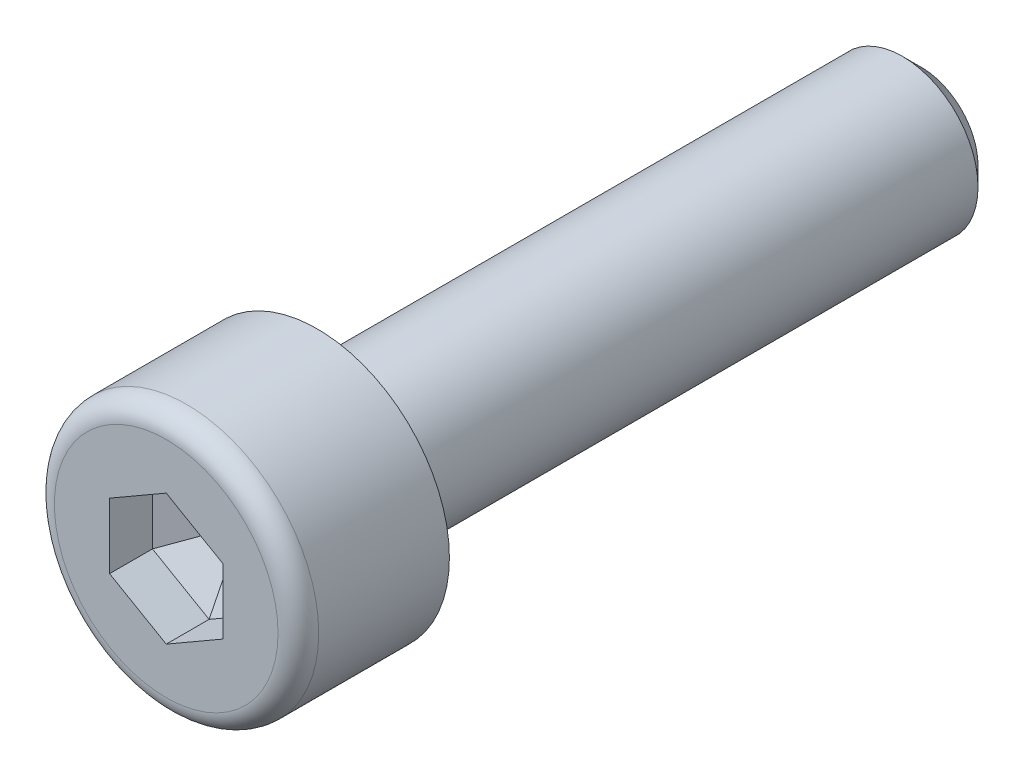
ISO-10303-21;
HEADER;
FILE_DESCRIPTION(('STEP AP214'),'2;1');
FILE_NAME('part.step','',(''),(''),'','','');
FILE_SCHEMA(('AUTOMOTIVE_DESIGN { 1 0 10303 214 1 1 1 1 }'));
ENDSEC;
DATA;
#1=APPLICATION_CONTEXT('core data for automotive mechanical design processes');
#2=APPLICATION_PROTOCOL_DEFINITION('international standard','automotive_design',2000,#1);
#3=PRODUCT_CONTEXT('',#1,'mechanical');
#4=PRODUCT('Part','Part','',(#3));
#5=PRODUCT_RELATED_PRODUCT_CATEGORY('part','',(#4));
#6=PRODUCT_DEFINITION_FORMATION('','',#4);
#7=PRODUCT_DEFINITION_CONTEXT('part definition',#1,'design');
#8=PRODUCT_DEFINITION('design','',#6,#7);
#9=PRODUCT_DEFINITION_SHAPE('','',#8);
#10=(LENGTH_UNIT() NAMED_UNIT(*) SI_UNIT(.MILLI.,.METRE.));
#11=(NAMED_UNIT(*) PLANE_ANGLE_UNIT() SI_UNIT($,.RADIAN.));
#12=(NAMED_UNIT(*) SI_UNIT($,.STERADIAN.) SOLID_ANGLE_UNIT());
#13=UNCERTAINTY_MEASURE_WITH_UNIT(LENGTH_MEASURE(1.E-05),#10,'distance_accuracy_value','');
#14=(GEOMETRIC_REPRESENTATION_CONTEXT(3) GLOBAL_UNCERTAINTY_ASSIGNED_CONTEXT((#13)) GLOBAL_UNIT_ASSIGNED_CONTEXT((#10,
#11,#12)) REPRESENTATION_CONTEXT('',''));
#15=CARTESIAN_POINT('',(0.,0.,0.));
#16=DIRECTION('',(0.,0.,1.));
#17=DIRECTION('',(1.,0.,0.));
#18=AXIS2_PLACEMENT_3D('',#15,#16,#17);
#19=CARTESIAN_POINT('',(0.,0.,0.));
#20=DIRECTION('',(0.,0.,1.));
#21=DIRECTION('',(1.,0.,0.));
#22=AXIS2_PLACEMENT_3D('',#19,#20,#21);
#23=PLANE('',#22);
#24=CARTESIAN_POINT('',(0.,0.,0.));
#25=DIRECTION('',(0.,0.,1.));
#26=DIRECTION('',(1.,0.,0.));
#27=AXIS2_PLACEMENT_3D('',#24,#25,#26);
#28=CIRCLE('',#27,2.1);
#29=CARTESIAN_POINT('',(2.1,0.,0.));
#30=VERTEX_POINT('',#29);
#31=EDGE_CURVE('E11',#30,#30,#28,.T.);
#32=ORIENTED_EDGE('',*,*,#31,.T.);
#33=EDGE_LOOP('',(#32));
#34=FACE_BOUND('',#33,.T.);
#35=CARTESIAN_POINT('',(0.,0.,0.));
#36=DIRECTION('',(0.,0.,1.));
#37=DIRECTION('',(1.,0.,0.));
#38=AXIS2_PLACEMENT_3D('',#35,#36,#37);
#39=CIRCLE('',#38,3.5);
#40=CARTESIAN_POINT('',(3.5,0.,0.));
#41=VERTEX_POINT('',#40);
#42=EDGE_CURVE('E154',#41,#41,#39,.T.);
#43=ORIENTED_EDGE('',*,*,#42,.F.);
#44=EDGE_LOOP('',(#43));
#45=FACE_BOUND('',#44,.T.);
#46=ADVANCED_FACE('F44',(#34,#45),#23,.F.);
#47=CARTESIAN_POINT('',(0.,0.,4.));
#48=DIRECTION('',(0.,0.,-1.));
#49=DIRECTION('',(-1.,0.,0.));
#50=AXIS2_PLACEMENT_3D('',#47,#48,#49);
#51=CYLINDRICAL_SURFACE('',#50,3.5);
#52=CARTESIAN_POINT('',(0.,0.,3.46153846153846));
#53=DIRECTION('',(0.,0.,1.));
#54=DIRECTION('',(1.,0.,0.));
#55=AXIS2_PLACEMENT_3D('',#52,#53,#54);
#56=CIRCLE('',#55,3.5);
#57=CARTESIAN_POINT('',(3.5,0.,3.46153846153846));
#58=VERTEX_POINT('',#57);
#59=EDGE_CURVE('E172',#58,#58,#56,.F.);
#60=ORIENTED_EDGE('',*,*,#59,.T.);
#61=EDGE_LOOP('',(#60));
#62=FACE_BOUND('',#61,.T.);
#63=ORIENTED_EDGE('',*,*,#42,.T.);
#64=EDGE_LOOP('',(#63));
#65=FACE_BOUND('',#64,.T.);
#66=ADVANCED_FACE('F231',(#62,#65),#51,.T.);
#67=CARTESIAN_POINT('',(0.,0.,4.));
#68=DIRECTION('',(0.,0.,1.));
#69=DIRECTION('',(1.,0.,0.));
#70=AXIS2_PLACEMENT_3D('',#67,#68,#69);
#71=PLANE('',#70);
#72=CARTESIAN_POINT('',(0.,0.,4.));
#73=DIRECTION('',(0.,0.,1.));
#74=DIRECTION('',(1.,0.,0.));
#75=AXIS2_PLACEMENT_3D('',#72,#73,#74);
#76=CIRCLE('',#75,2.96153846153846);
#77=CARTESIAN_POINT('',(2.96153846153846,0.,4.));
#78=VERTEX_POINT('',#77);
#79=EDGE_CURVE('E169',#78,#78,#76,.T.);
#80=ORIENTED_EDGE('',*,*,#79,.T.);
#81=EDGE_LOOP('',(#80));
#82=FACE_BOUND('',#81,.T.);
#83=DIRECTION('',(0.,1.,0.));
#84=VECTOR('',#83,1.);
#85=CARTESIAN_POINT('',(1.5,-0.866025403784439,4.));
#86=LINE('',#85,#84);
#87=CARTESIAN_POINT('',(1.5,-0.866025403784439,4.));
#88=VERTEX_POINT('',#87);
#89=CARTESIAN_POINT('',(1.5,0.866025403784439,4.));
#90=VERTEX_POINT('',#89);
#91=EDGE_CURVE('E136',#88,#90,#86,.T.);
#92=ORIENTED_EDGE('',*,*,#91,.F.);
#93=DIRECTION('',(0.866025403784439,0.5,0.));
#94=VECTOR('',#93,1.);
#95=CARTESIAN_POINT('',(0.,-1.73205080756888,4.));
#96=LINE('',#95,#94);
#97=CARTESIAN_POINT('',(0.,-1.73205080756888,4.));
#98=VERTEX_POINT('',#97);
#99=EDGE_CURVE('E149',#98,#88,#96,.T.);
#100=ORIENTED_EDGE('',*,*,#99,.F.);
#101=DIRECTION('',(0.866025403784439,-0.5,0.));
#102=VECTOR('',#101,1.);
#103=CARTESIAN_POINT('',(-1.5,-0.866025403784438,4.));
#104=LINE('',#103,#102);
#105=CARTESIAN_POINT('',(-1.5,-0.866025403784438,4.));
#106=VERTEX_POINT('',#105);
#107=EDGE_CURVE('E143',#106,#98,#104,.T.);
#108=ORIENTED_EDGE('',*,*,#107,.F.);
#109=DIRECTION('',(0.,-1.,0.));
#110=VECTOR('',#109,1.);
#111=CARTESIAN_POINT('',(-1.5,0.866025403784439,4.));
#112=LINE('',#111,#110);
#113=CARTESIAN_POINT('',(-1.5,0.866025403784439,4.));
#114=VERTEX_POINT('',#113);
#115=EDGE_CURVE('E141',#114,#106,#112,.T.);
#116=ORIENTED_EDGE('',*,*,#115,.F.);
#117=DIRECTION('',(-0.866025403784439,-0.5,0.));
#118=VECTOR('',#117,1.);
#119=CARTESIAN_POINT('',(0.,1.73205080756888,4.));
#120=LINE('',#119,#118);
#121=CARTESIAN_POINT('',(0.,1.73205080756888,4.));
#122=VERTEX_POINT('',#121);
#123=EDGE_CURVE('E121',#122,#114,#120,.T.);
#124=ORIENTED_EDGE('',*,*,#123,.F.);
#125=DIRECTION('',(-0.866025403784439,0.5,0.));
#126=VECTOR('',#125,1.);
#127=CARTESIAN_POINT('',(1.5,0.866025403784439,4.));
#128=LINE('',#127,#126);
#129=EDGE_CURVE('E131',#90,#122,#128,.T.);
#130=ORIENTED_EDGE('',*,*,#129,.F.);
#131=EDGE_LOOP('',(#92,#100,#108,#116,#124,#130));
#132=FACE_BOUND('',#131,.T.);
#133=ADVANCED_FACE('F138',(#82,#132),#71,.T.);
#134=CARTESIAN_POINT('',(1.5,-0.866025403784439,2.));
#135=DIRECTION('',(1.,0.,0.));
#136=DIRECTION('',(0.,1.,0.));
#137=AXIS2_PLACEMENT_3D('',#134,#135,#136);
#138=PLANE('',#137);
#139=DIRECTION('',(0.,0.,1.));
#140=VECTOR('',#139,1.);
#141=CARTESIAN_POINT('',(1.5,0.866025403784439,2.));
#142=LINE('',#141,#140);
#143=CARTESIAN_POINT('',(1.5,0.866025403784439,2.86455331412104));
#144=VERTEX_POINT('',#143);
#145=EDGE_CURVE('E128',#144,#90,#142,.T.);
#146=ORIENTED_EDGE('',*,*,#145,.F.);
#147=DIRECTION('',(0.,-1.,0.));
#148=VECTOR('',#147,1.);
#149=CARTESIAN_POINT('',(1.5,-0.866025403784439,2.86455331412104));
#150=LINE('',#149,#148);
#151=CARTESIAN_POINT('',(1.5,-0.866025403784439,2.86455331412104));
#152=VERTEX_POINT('',#151);
#153=EDGE_CURVE('E67',#144,#152,#150,.T.);
#154=ORIENTED_EDGE('',*,*,#153,.T.);
#155=DIRECTION('',(0.,0.,1.));
#156=VECTOR('',#155,1.);
#157=CARTESIAN_POINT('',(1.5,-0.866025403784439,2.));
#158=LINE('',#157,#156);
#159=EDGE_CURVE('E152',#152,#88,#158,.T.);
#160=ORIENTED_EDGE('',*,*,#159,.T.);
#161=ORIENTED_EDGE('',*,*,#91,.T.);
#162=EDGE_LOOP('',(#146,#154,#160,#161));
#163=FACE_BOUND('',#162,.T.);
#164=ADVANCED_FACE('F291',(#163),#138,.F.);
#165=CARTESIAN_POINT('',(0.,-1.73205080756888,2.));
#166=DIRECTION('',(0.5,-0.866025403784439,0.));
#167=DIRECTION('',(0.866025403784439,0.5,0.));
#168=AXIS2_PLACEMENT_3D('',#165,#166,#167);
#169=PLANE('',#168);
#170=ORIENTED_EDGE('',*,*,#159,.F.);
#171=DIRECTION('',(-0.866025403784439,-0.5,0.));
#172=VECTOR('',#171,1.);
#173=CARTESIAN_POINT('',(0.,-1.73205080756888,2.86455331412104));
#174=LINE('',#173,#172);
#175=CARTESIAN_POINT('',(0.,-1.73205080756888,2.86455331412104));
#176=VERTEX_POINT('',#175);
#177=EDGE_CURVE('E59',#152,#176,#174,.T.);
#178=ORIENTED_EDGE('',*,*,#177,.T.);
#179=DIRECTION('',(0.,0.,1.));
#180=VECTOR('',#179,1.);
#181=CARTESIAN_POINT('',(0.,-1.73205080756888,2.));
#182=LINE('',#181,#180);
#183=EDGE_CURVE('E155',#176,#98,#182,.T.);
#184=ORIENTED_EDGE('',*,*,#183,.T.);
#185=ORIENTED_EDGE('',*,*,#99,.T.);
#186=EDGE_LOOP('',(#170,#178,#184,#185));
#187=FACE_BOUND('',#186,.T.);
#188=ADVANCED_FACE('F293',(#187),#169,.F.);
#189=CARTESIAN_POINT('',(-1.5,-0.866025403784438,2.));
#190=DIRECTION('',(-0.5,-0.866025403784439,0.));
#191=DIRECTION('',(0.866025403784439,-0.5,0.));
#192=AXIS2_PLACEMENT_3D('',#189,#190,#191);
#193=PLANE('',#192);
#194=ORIENTED_EDGE('',*,*,#183,.F.);
#195=DIRECTION('',(-0.866025403784439,0.5,0.));
#196=VECTOR('',#195,1.);
#197=CARTESIAN_POINT('',(-1.5,-0.866025403784438,2.86455331412104));
#198=LINE('',#197,#196);
#199=CARTESIAN_POINT('',(-1.5,-0.866025403784438,2.86455331412104));
#200=VERTEX_POINT('',#199);
#201=EDGE_CURVE('E195',#176,#200,#198,.T.);
#202=ORIENTED_EDGE('',*,*,#201,.T.);
#203=DIRECTION('',(0.,0.,1.));
#204=VECTOR('',#203,1.);
#205=CARTESIAN_POINT('',(-1.5,-0.866025403784438,2.));
#206=LINE('',#205,#204);
#207=EDGE_CURVE('E157',#200,#106,#206,.T.);
#208=ORIENTED_EDGE('',*,*,#207,.T.);
#209=ORIENTED_EDGE('',*,*,#107,.T.);
#210=EDGE_LOOP('',(#194,#202,#208,#209));
#211=FACE_BOUND('',#210,.T.);
#212=ADVANCED_FACE('F282',(#211),#193,.F.);
#213=CARTESIAN_POINT('',(-1.5,0.866025403784439,2.));
#214=DIRECTION('',(-1.,0.,0.));
#215=DIRECTION('',(0.,0.,1.));
#216=AXIS2_PLACEMENT_3D('',#213,#214,#215);
#217=PLANE('',#216);
#218=ORIENTED_EDGE('',*,*,#207,.F.);
#219=DIRECTION('',(0.,1.,0.));
#220=VECTOR('',#219,1.);
#221=CARTESIAN_POINT('',(-1.5,0.866025403784439,2.86455331412104));
#222=LINE('',#221,#220);
#223=CARTESIAN_POINT('',(-1.5,0.866025403784439,2.86455331412104));
#224=VERTEX_POINT('',#223);
#225=EDGE_CURVE('E188',#200,#224,#222,.T.);
#226=ORIENTED_EDGE('',*,*,#225,.T.);
#227=DIRECTION('',(0.,0.,1.));
#228=VECTOR('',#227,1.);
#229=CARTESIAN_POINT('',(-1.5,0.866025403784439,2.));
#230=LINE('',#229,#228);
#231=EDGE_CURVE('E127',#224,#114,#230,.T.);
#232=ORIENTED_EDGE('',*,*,#231,.T.);
#233=ORIENTED_EDGE('',*,*,#115,.T.);
#234=EDGE_LOOP('',(#218,#226,#232,#233));
#235=FACE_BOUND('',#234,.T.);
#236=ADVANCED_FACE('F285',(#235),#217,.F.);
#237=CARTESIAN_POINT('',(0.,1.73205080756888,2.));
#238=DIRECTION('',(-0.5,0.866025403784439,0.));
#239=DIRECTION('',(-0.866025403784439,-0.5,0.));
#240=AXIS2_PLACEMENT_3D('',#237,#238,#239);
#241=PLANE('',#240);
#242=ORIENTED_EDGE('',*,*,#231,.F.);
#243=DIRECTION('',(0.866025403784439,0.5,0.));
#244=VECTOR('',#243,1.);
#245=CARTESIAN_POINT('',(0.,1.73205080756888,2.86455331412104));
#246=LINE('',#245,#244);
#247=CARTESIAN_POINT('',(0.,1.73205080756888,2.86455331412104));
#248=VERTEX_POINT('',#247);
#249=EDGE_CURVE('E124',#224,#248,#246,.T.);
#250=ORIENTED_EDGE('',*,*,#249,.T.);
#251=DIRECTION('',(0.,0.,1.));
#252=VECTOR('',#251,1.);
#253=CARTESIAN_POINT('',(0.,1.73205080756888,2.));
#254=LINE('',#253,#252);
#255=EDGE_CURVE('E116',#248,#122,#254,.T.);
#256=ORIENTED_EDGE('',*,*,#255,.T.);
#257=ORIENTED_EDGE('',*,*,#123,.T.);
#258=EDGE_LOOP('',(#242,#250,#256,#257));
#259=FACE_BOUND('',#258,.T.);
#260=ADVANCED_FACE('F119',(#259),#241,.F.);
#261=CARTESIAN_POINT('',(1.5,0.866025403784439,2.));
#262=DIRECTION('',(0.5,0.866025403784439,0.));
#263=DIRECTION('',(-0.866025403784439,0.5,0.));
#264=AXIS2_PLACEMENT_3D('',#261,#262,#263);
#265=PLANE('',#264);
#266=ORIENTED_EDGE('',*,*,#255,.F.);
#267=DIRECTION('',(0.866025403784439,-0.5,0.));
#268=VECTOR('',#267,1.);
#269=CARTESIAN_POINT('',(1.5,0.866025403784439,2.86455331412104));
#270=LINE('',#269,#268);
#271=EDGE_CURVE('E192',#248,#144,#270,.T.);
#272=ORIENTED_EDGE('',*,*,#271,.T.);
#273=ORIENTED_EDGE('',*,*,#145,.T.);
#274=ORIENTED_EDGE('',*,*,#129,.T.);
#275=EDGE_LOOP('',(#266,#272,#273,#274));
#276=FACE_BOUND('',#275,.T.);
#277=ADVANCED_FACE('F132',(#276),#265,.F.);
#278=CARTESIAN_POINT('',(0.,0.,2.));
#279=DIRECTION('',(0.,0.,1.));
#280=DIRECTION('',(1.,0.,0.));
#281=AXIS2_PLACEMENT_3D('',#278,#279,#280);
#282=PLANE('',#281);
#283=DIRECTION('',(-0.866025403784439,-0.5,0.));
#284=VECTOR('',#283,1.);
#285=CARTESIAN_POINT('',(-0.00127486704514635,0.00220813449508868,2.));
#286=LINE('',#285,#284);
#287=CARTESIAN_POINT('',(0.,0.00294417932678523,2.));
#288=VERTEX_POINT('',#287);
#289=CARTESIAN_POINT('',(-0.00254973409029302,0.00147208966339225,2.));
#290=VERTEX_POINT('',#289);
#291=EDGE_CURVE('E183',#288,#290,#286,.T.);
#292=ORIENTED_EDGE('',*,*,#291,.T.);
#293=DIRECTION('',(0.,-1.,0.));
#294=VECTOR('',#293,1.);
#295=CARTESIAN_POINT('',(-0.00254973409029302,0.,2.));
#296=LINE('',#295,#294);
#297=CARTESIAN_POINT('',(-0.00254973409029302,-0.00147208966339184,2.));
#298=VERTEX_POINT('',#297);
#299=EDGE_CURVE('E185',#290,#298,#296,.T.);
#300=ORIENTED_EDGE('',*,*,#299,.T.);
#301=DIRECTION('',(0.866025403784439,-0.5,0.));
#302=VECTOR('',#301,1.);
#303=CARTESIAN_POINT('',(-0.00127486704514616,-0.00220813449508835,2.));
#304=LINE('',#303,#302);
#305=CARTESIAN_POINT('',(0.,-0.00294417932678486,2.));
#306=VERTEX_POINT('',#305);
#307=EDGE_CURVE('E177',#298,#306,#304,.T.);
#308=ORIENTED_EDGE('',*,*,#307,.T.);
#309=DIRECTION('',(0.866025403784439,0.5,0.));
#310=VECTOR('',#309,1.);
#311=CARTESIAN_POINT('',(0.00127486704514651,-0.00220813449508896,2.));
#312=LINE('',#311,#310);
#313=CARTESIAN_POINT('',(0.00254973409029291,-0.00147208966339269,2.));
#314=VERTEX_POINT('',#313);
#315=EDGE_CURVE('E175',#306,#314,#312,.T.);
#316=ORIENTED_EDGE('',*,*,#315,.T.);
#317=DIRECTION('',(0.,1.,0.));
#318=VECTOR('',#317,1.);
#319=CARTESIAN_POINT('',(0.00254973409029291,0.,2.));
#320=LINE('',#319,#318);
#321=CARTESIAN_POINT('',(0.00254973409029291,0.00147208966339301,2.));
#322=VERTEX_POINT('',#321);
#323=EDGE_CURVE('E179',#314,#322,#320,.T.);
#324=ORIENTED_EDGE('',*,*,#323,.T.);
#325=DIRECTION('',(-0.866025403784439,0.5,0.));
#326=VECTOR('',#325,1.);
#327=CARTESIAN_POINT('',(0.00127486704514662,0.00220813449508915,2.));
#328=LINE('',#327,#326);
#329=EDGE_CURVE('E181',#322,#288,#328,.T.);
#330=ORIENTED_EDGE('',*,*,#329,.T.);
#331=EDGE_LOOP('',(#292,#300,#308,#316,#324,#330));
#332=FACE_BOUND('',#331,.T.);
#333=ADVANCED_FACE('F302',(#332),#282,.T.);
#334=CARTESIAN_POINT('',(0.,0.,-16.));
#335=DIRECTION('',(0.,0.,1.));
#336=DIRECTION('',(1.,0.,0.));
#337=AXIS2_PLACEMENT_3D('',#334,#335,#336);
#338=CYLINDRICAL_SURFACE('',#337,2.);
#339=CARTESIAN_POINT('',(0.,0.,-0.0999999999999994));
#340=DIRECTION('',(0.,0.,1.));
#341=DIRECTION('',(1.,0.,0.));
#342=AXIS2_PLACEMENT_3D('',#339,#340,#341);
#343=CIRCLE('',#342,2.);
#344=CARTESIAN_POINT('',(2.,0.,-0.0999999999999994));
#345=VERTEX_POINT('',#344);
#346=EDGE_CURVE('E52',#345,#345,#343,.F.);
#347=ORIENTED_EDGE('',*,*,#346,.T.);
#348=EDGE_LOOP('',(#347));
#349=FACE_BOUND('',#348,.T.);
#350=CARTESIAN_POINT('',(0.,0.,-15.5));
#351=DIRECTION('',(0.,0.,-1.));
#352=DIRECTION('',(-1.,0.,0.));
#353=AXIS2_PLACEMENT_3D('',#350,#351,#352);
#354=CIRCLE('',#353,2.);
#355=CARTESIAN_POINT('',(-2.,0.,-15.5));
#356=VERTEX_POINT('',#355);
#357=EDGE_CURVE('E166',#356,#356,#354,.F.);
#358=ORIENTED_EDGE('',*,*,#357,.T.);
#359=EDGE_LOOP('',(#358));
#360=FACE_BOUND('',#359,.T.);
#361=ADVANCED_FACE('F216',(#349,#360),#338,.T.);
#362=CARTESIAN_POINT('',(0.,0.,-16.));
#363=DIRECTION('',(0.,0.,-1.));
#364=DIRECTION('',(-1.,0.,0.));
#365=AXIS2_PLACEMENT_3D('',#362,#363,#364);
#366=PLANE('',#365);
#367=CARTESIAN_POINT('',(0.,0.,-16.));
#368=DIRECTION('',(0.,0.,-1.));
#369=DIRECTION('',(-1.,0.,0.));
#370=AXIS2_PLACEMENT_3D('',#367,#368,#369);
#371=CIRCLE('',#370,1.5);
#372=CARTESIAN_POINT('',(-1.5,0.,-16.));
#373=VERTEX_POINT('',#372);
#374=EDGE_CURVE('E163',#373,#373,#371,.T.);
#375=ORIENTED_EDGE('',*,*,#374,.T.);
#376=EDGE_LOOP('',(#375));
#377=FACE_BOUND('',#376,.T.);
#378=ADVANCED_FACE('F247',(#377),#366,.T.);
#379=CARTESIAN_POINT('',(0.,0.,-16.));
#380=DIRECTION('',(0.,0.,1.));
#381=DIRECTION('',(1.,0.,0.));
#382=AXIS2_PLACEMENT_3D('',#379,#380,#381);
#383=CONICAL_SURFACE('',#382,1.5,0.785398163397445);
#384=ORIENTED_EDGE('',*,*,#357,.F.);
#385=EDGE_LOOP('',(#384));
#386=FACE_BOUND('',#385,.T.);
#387=ORIENTED_EDGE('',*,*,#374,.F.);
#388=EDGE_LOOP('',(#387));
#389=FACE_BOUND('',#388,.T.);
#390=ADVANCED_FACE('F243',(#386,#389),#383,.T.);
#391=CARTESIAN_POINT('',(0.,0.,3.46153846153846));
#392=DIRECTION('',(0.,0.,1.));
#393=DIRECTION('',(1.,0.,0.));
#394=AXIS2_PLACEMENT_3D('',#391,#392,#393);
#395=TOROIDAL_SURFACE('',#394,2.96153846153846,0.538461538461538);
#396=ORIENTED_EDGE('',*,*,#59,.F.);
#397=EDGE_LOOP('',(#396));
#398=FACE_BOUND('',#397,.T.);
#399=ORIENTED_EDGE('',*,*,#79,.F.);
#400=EDGE_LOOP('',(#399));
#401=FACE_BOUND('',#400,.T.);
#402=ADVANCED_FACE('F246',(#398,#401),#395,.T.);
#403=CARTESIAN_POINT('',(0.00254973409029291,0.,2.));
#404=DIRECTION('',(0.499999999999996,0.,-0.866025403784441));
#405=DIRECTION('',(0.,1.,0.));
#406=AXIS2_PLACEMENT_3D('',#403,#404,#405);
#407=PLANE('',#406);
#408=DIRECTION('',(-0.774596669241485,0.447213595499959,-0.447213595499954));
#409=VECTOR('',#408,1.);
#410=CARTESIAN_POINT('',(0.00203978727223428,-0.00117767173071416,1.99970558206732));
#411=LINE('',#410,#409);
#412=EDGE_CURVE('E208',#152,#314,#411,.T.);
#413=ORIENTED_EDGE('',*,*,#412,.F.);
#414=ORIENTED_EDGE('',*,*,#153,.F.);
#415=DIRECTION('',(-0.774596669241485,-0.447213595499959,-0.447213595499954));
#416=VECTOR('',#415,1.);
#417=CARTESIAN_POINT('',(0.0020397872722344,0.00117767173071454,1.99970558206732));
#418=LINE('',#417,#416);
#419=EDGE_CURVE('E211',#322,#144,#418,.F.);
#420=ORIENTED_EDGE('',*,*,#419,.F.);
#421=ORIENTED_EDGE('',*,*,#323,.F.);
#422=EDGE_LOOP('',(#413,#414,#420,#421));
#423=FACE_BOUND('',#422,.T.);
#424=ADVANCED_FACE('F250',(#423),#407,.F.);
#425=CARTESIAN_POINT('',(0.00127486704514665,0.0022081344950892,2.));
#426=DIRECTION('',(0.249999999999998,0.433012701892216,-0.866025403784441));
#427=DIRECTION('',(-0.866025403784439,0.5,0.));
#428=AXIS2_PLACEMENT_3D('',#425,#426,#427);
#429=PLANE('',#428);
#430=ORIENTED_EDGE('',*,*,#419,.T.);
#431=ORIENTED_EDGE('',*,*,#271,.F.);
#432=DIRECTION('',(0.,-0.894427190999918,-0.447213595499954));
#433=VECTOR('',#432,1.);
#434=CARTESIAN_POINT('',(0.,0.00235534346142795,1.99970558206732));
#435=LINE('',#434,#433);
#436=EDGE_CURVE('E205',#288,#248,#435,.F.);
#437=ORIENTED_EDGE('',*,*,#436,.F.);
#438=ORIENTED_EDGE('',*,*,#329,.F.);
#439=EDGE_LOOP('',(#430,#431,#437,#438));
#440=FACE_BOUND('',#439,.T.);
#441=ADVANCED_FACE('F263',(#440),#429,.F.);
#442=CARTESIAN_POINT('',(0.00127486704514651,-0.00220813449508896,2.));
#443=DIRECTION('',(0.249999999999998,-0.433012701892216,-0.866025403784441));
#444=DIRECTION('',(0.866025403784439,0.5,0.));
#445=AXIS2_PLACEMENT_3D('',#442,#443,#444);
#446=PLANE('',#445);
#447=ORIENTED_EDGE('',*,*,#412,.T.);
#448=ORIENTED_EDGE('',*,*,#315,.F.);
#449=DIRECTION('',(0.,-0.894427190999918,0.447213595499954));
#450=VECTOR('',#449,1.);
#451=CARTESIAN_POINT('',(0.,-0.00235534346142774,1.99970558206732));
#452=LINE('',#451,#450);
#453=EDGE_CURVE('E202',#176,#306,#452,.F.);
#454=ORIENTED_EDGE('',*,*,#453,.F.);
#455=ORIENTED_EDGE('',*,*,#177,.F.);
#456=EDGE_LOOP('',(#447,#448,#454,#455));
#457=FACE_BOUND('',#456,.T.);
#458=ADVANCED_FACE('F259',(#457),#446,.F.);
#459=CARTESIAN_POINT('',(-0.00127486704514632,0.00220813449508863,2.));
#460=DIRECTION('',(-0.249999999999998,0.433012701892216,-0.866025403784441));
#461=DIRECTION('',(-0.866025403784439,-0.5,0.));
#462=AXIS2_PLACEMENT_3D('',#459,#460,#461);
#463=PLANE('',#462);
#464=ORIENTED_EDGE('',*,*,#436,.T.);
#465=ORIENTED_EDGE('',*,*,#249,.F.);
#466=DIRECTION('',(0.774596669241485,-0.447213595499959,-0.447213595499954));
#467=VECTOR('',#466,1.);
#468=CARTESIAN_POINT('',(-0.00203978727223457,0.00117767173071376,1.99970558206732));
#469=LINE('',#468,#467);
#470=EDGE_CURVE('E200',#290,#224,#469,.F.);
#471=ORIENTED_EDGE('',*,*,#470,.F.);
#472=ORIENTED_EDGE('',*,*,#291,.F.);
#473=EDGE_LOOP('',(#464,#465,#471,#472));
#474=FACE_BOUND('',#473,.T.);
#475=ADVANCED_FACE('F255',(#474),#463,.F.);
#476=CARTESIAN_POINT('',(-0.00127486704514621,-0.00220813449508845,2.));
#477=DIRECTION('',(-0.249999999999998,-0.433012701892216,-0.866025403784441));
#478=DIRECTION('',(0.866025403784439,-0.5,0.));
#479=AXIS2_PLACEMENT_3D('',#476,#477,#478);
#480=PLANE('',#479);
#481=ORIENTED_EDGE('',*,*,#453,.T.);
#482=ORIENTED_EDGE('',*,*,#307,.F.);
#483=DIRECTION('',(-0.774596669241485,-0.447213595499959,0.447213595499954));
#484=VECTOR('',#483,1.);
#485=CARTESIAN_POINT('',(-0.00203978727223465,-0.00117767173071356,1.99970558206732));
#486=LINE('',#485,#484);
#487=EDGE_CURVE('E198',#200,#298,#486,.F.);
#488=ORIENTED_EDGE('',*,*,#487,.F.);
#489=ORIENTED_EDGE('',*,*,#201,.F.);
#490=EDGE_LOOP('',(#481,#482,#488,#489));
#491=FACE_BOUND('',#490,.T.);
#492=ADVANCED_FACE('F226',(#491),#480,.F.);
#493=CARTESIAN_POINT('',(-0.00254973409029302,0.,2.));
#494=DIRECTION('',(-0.499999999999996,0.,-0.866025403784441));
#495=DIRECTION('',(0.,-1.,0.));
#496=AXIS2_PLACEMENT_3D('',#493,#494,#495);
#497=PLANE('',#496);
#498=ORIENTED_EDGE('',*,*,#470,.T.);
#499=ORIENTED_EDGE('',*,*,#225,.F.);
#500=ORIENTED_EDGE('',*,*,#487,.T.);
#501=ORIENTED_EDGE('',*,*,#299,.F.);
#502=EDGE_LOOP('',(#498,#499,#500,#501));
#503=FACE_BOUND('',#502,.T.);
#504=ADVANCED_FACE('F220',(#503),#497,.F.);
#505=CARTESIAN_POINT('',(0.,0.,-0.0999999999999994));
#506=DIRECTION('',(0.,0.,1.));
#507=DIRECTION('',(1.,0.,0.));
#508=AXIS2_PLACEMENT_3D('',#505,#506,#507);
#509=TOROIDAL_SURFACE('',#508,2.1,0.1);
#510=ORIENTED_EDGE('',*,*,#31,.F.);
#511=EDGE_LOOP('',(#510));
#512=FACE_BOUND('',#511,.T.);
#513=ORIENTED_EDGE('',*,*,#346,.F.);
#514=EDGE_LOOP('',(#513));
#515=FACE_BOUND('',#514,.T.);
#516=ADVANCED_FACE('F46',(#512,#515),#509,.F.);
#517=CLOSED_SHELL('',(#46,#66,#133,#164,#188,#212,#236,#260,#277,#333,#361,#378,#390,#402,#424,
#441,#458,#475,#492,#504,#516));
#518=MANIFOLD_SOLID_BREP('B2',#517);
#519=ADVANCED_BREP_SHAPE_REPRESENTATION('',(#18,#518),#14);
#520=SHAPE_DEFINITION_REPRESENTATION(#9,#519);
ENDSEC;
END-ISO-10303-21;
